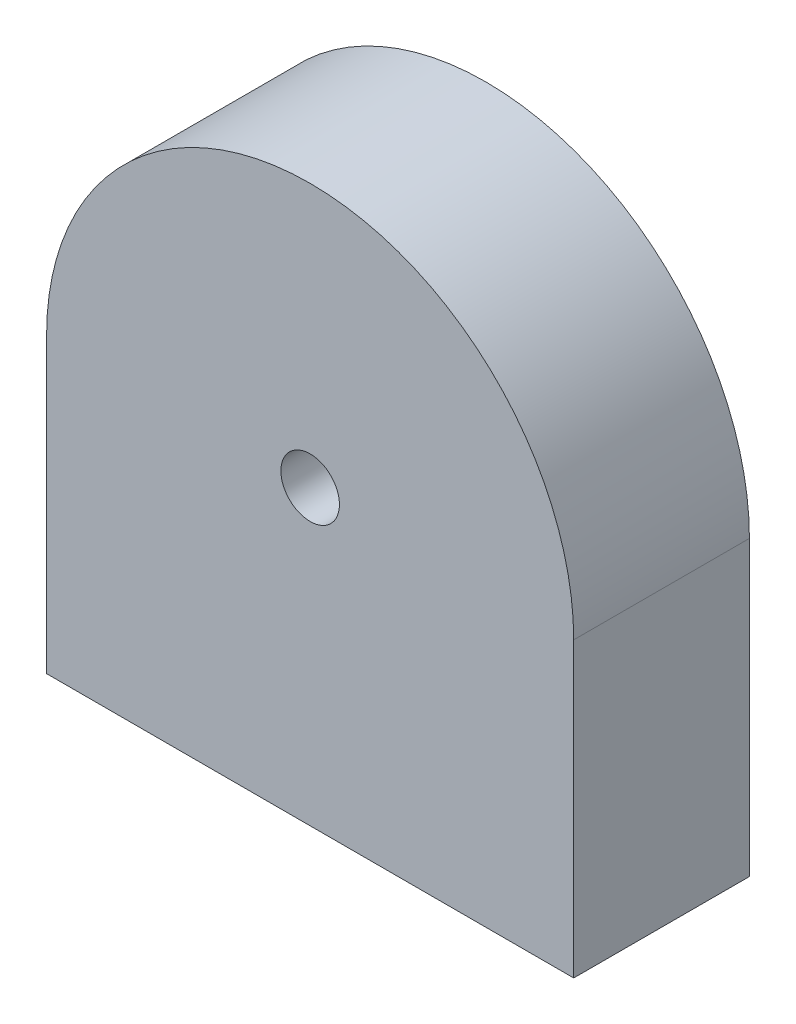
ISO-10303-21;
HEADER;
FILE_DESCRIPTION(('STEP AP214'),'2;1');
FILE_NAME('part.step','',(''),(''),'','','');
FILE_SCHEMA(('AUTOMOTIVE_DESIGN { 1 0 10303 214 1 1 1 1 }'));
ENDSEC;
DATA;
#1=APPLICATION_CONTEXT('core data for automotive mechanical design processes');
#2=APPLICATION_PROTOCOL_DEFINITION('international standard','automotive_design',2000,#1);
#3=PRODUCT_CONTEXT('',#1,'mechanical');
#4=PRODUCT('Part','Part','',(#3));
#5=PRODUCT_RELATED_PRODUCT_CATEGORY('part','',(#4));
#6=PRODUCT_DEFINITION_FORMATION('','',#4);
#7=PRODUCT_DEFINITION_CONTEXT('part definition',#1,'design');
#8=PRODUCT_DEFINITION('design','',#6,#7);
#9=PRODUCT_DEFINITION_SHAPE('','',#8);
#10=(LENGTH_UNIT() NAMED_UNIT(*) SI_UNIT(.MILLI.,.METRE.));
#11=(NAMED_UNIT(*) PLANE_ANGLE_UNIT() SI_UNIT($,.RADIAN.));
#12=(NAMED_UNIT(*) SI_UNIT($,.STERADIAN.) SOLID_ANGLE_UNIT());
#13=UNCERTAINTY_MEASURE_WITH_UNIT(LENGTH_MEASURE(1.E-05),#10,'distance_accuracy_value','');
#14=(GEOMETRIC_REPRESENTATION_CONTEXT(3) GLOBAL_UNCERTAINTY_ASSIGNED_CONTEXT((#13)) GLOBAL_UNIT_ASSIGNED_CONTEXT((#10,
#11,#12)) REPRESENTATION_CONTEXT('',''));
#15=CARTESIAN_POINT('',(0.,0.,0.));
#16=DIRECTION('',(0.,0.,1.));
#17=DIRECTION('',(1.,0.,0.));
#18=AXIS2_PLACEMENT_3D('',#15,#16,#17);
#19=CARTESIAN_POINT('',(4.5,5.,3.));
#20=DIRECTION('',(0.,0.,1.));
#21=DIRECTION('',(1.,0.,0.));
#22=AXIS2_PLACEMENT_3D('',#19,#20,#21);
#23=PLANE('',#22);
#24=DIRECTION('',(0.,-1.,0.));
#25=VECTOR('',#24,1.);
#26=CARTESIAN_POINT('',(0.,0.,3.));
#27=LINE('',#26,#25);
#28=CARTESIAN_POINT('',(0.,5.,3.));
#29=VERTEX_POINT('',#28);
#30=CARTESIAN_POINT('',(0.,0.,3.));
#31=VERTEX_POINT('',#30);
#32=EDGE_CURVE('E85',#29,#31,#27,.T.);
#33=ORIENTED_EDGE('',*,*,#32,.T.);
#34=DIRECTION('',(1.,0.,0.));
#35=VECTOR('',#34,1.);
#36=CARTESIAN_POINT('',(0.,0.,3.));
#37=LINE('',#36,#35);
#38=CARTESIAN_POINT('',(9.,0.,3.));
#39=VERTEX_POINT('',#38);
#40=EDGE_CURVE('E80',#31,#39,#37,.T.);
#41=ORIENTED_EDGE('',*,*,#40,.T.);
#42=DIRECTION('',(0.,1.,0.));
#43=VECTOR('',#42,1.);
#44=CARTESIAN_POINT('',(9.,0.,3.));
#45=LINE('',#44,#43);
#46=CARTESIAN_POINT('',(9.,5.,3.));
#47=VERTEX_POINT('',#46);
#48=EDGE_CURVE('E83',#39,#47,#45,.T.);
#49=ORIENTED_EDGE('',*,*,#48,.T.);
#50=CARTESIAN_POINT('',(4.5,5.,3.));
#51=DIRECTION('',(0.,0.,1.));
#52=DIRECTION('',(1.,0.,0.));
#53=AXIS2_PLACEMENT_3D('',#50,#51,#52);
#54=CIRCLE('',#53,4.5);
#55=EDGE_CURVE('E50',#47,#29,#54,.T.);
#56=ORIENTED_EDGE('',*,*,#55,.T.);
#57=EDGE_LOOP('',(#33,#41,#49,#56));
#58=FACE_BOUND('',#57,.T.);
#59=CARTESIAN_POINT('',(4.5,5.,3.));
#60=DIRECTION('',(0.,0.,1.));
#61=DIRECTION('',(1.,0.,0.));
#62=AXIS2_PLACEMENT_3D('',#59,#60,#61);
#63=CIRCLE('',#62,0.5);
#64=CARTESIAN_POINT('',(5.,5.,3.));
#65=VERTEX_POINT('',#64);
#66=EDGE_CURVE('E100',#65,#65,#63,.T.);
#67=ORIENTED_EDGE('',*,*,#66,.F.);
#68=EDGE_LOOP('',(#67));
#69=FACE_BOUND('',#68,.T.);
#70=ADVANCED_FACE('F33',(#58,#69),#23,.T.);
#71=CARTESIAN_POINT('',(4.5,5.,0.));
#72=DIRECTION('',(0.,0.,1.));
#73=DIRECTION('',(1.,0.,0.));
#74=AXIS2_PLACEMENT_3D('',#71,#72,#73);
#75=PLANE('',#74);
#76=DIRECTION('',(0.,-1.,0.));
#77=VECTOR('',#76,1.);
#78=CARTESIAN_POINT('',(0.,0.,0.));
#79=LINE('',#78,#77);
#80=CARTESIAN_POINT('',(0.,5.,0.));
#81=VERTEX_POINT('',#80);
#82=CARTESIAN_POINT('',(0.,0.,0.));
#83=VERTEX_POINT('',#82);
#84=EDGE_CURVE('E97',#81,#83,#79,.T.);
#85=ORIENTED_EDGE('',*,*,#84,.F.);
#86=CARTESIAN_POINT('',(4.5,5.,0.));
#87=DIRECTION('',(0.,0.,1.));
#88=DIRECTION('',(1.,0.,0.));
#89=AXIS2_PLACEMENT_3D('',#86,#87,#88);
#90=CIRCLE('',#89,4.5);
#91=CARTESIAN_POINT('',(9.,5.,0.));
#92=VERTEX_POINT('',#91);
#93=EDGE_CURVE('E73',#92,#81,#90,.T.);
#94=ORIENTED_EDGE('',*,*,#93,.F.);
#95=DIRECTION('',(0.,1.,0.));
#96=VECTOR('',#95,1.);
#97=CARTESIAN_POINT('',(9.,0.,0.));
#98=LINE('',#97,#96);
#99=CARTESIAN_POINT('',(9.,0.,0.));
#100=VERTEX_POINT('',#99);
#101=EDGE_CURVE('E67',#100,#92,#98,.T.);
#102=ORIENTED_EDGE('',*,*,#101,.F.);
#103=DIRECTION('',(1.,0.,0.));
#104=VECTOR('',#103,1.);
#105=CARTESIAN_POINT('',(0.,0.,0.));
#106=LINE('',#105,#104);
#107=EDGE_CURVE('E89',#83,#100,#106,.T.);
#108=ORIENTED_EDGE('',*,*,#107,.F.);
#109=EDGE_LOOP('',(#85,#94,#102,#108));
#110=FACE_BOUND('',#109,.T.);
#111=CARTESIAN_POINT('',(4.5,5.,0.));
#112=DIRECTION('',(0.,0.,1.));
#113=DIRECTION('',(1.,0.,0.));
#114=AXIS2_PLACEMENT_3D('',#111,#112,#113);
#115=CIRCLE('',#114,0.5);
#116=CARTESIAN_POINT('',(5.,5.,0.));
#117=VERTEX_POINT('',#116);
#118=EDGE_CURVE('E112',#117,#117,#115,.T.);
#119=ORIENTED_EDGE('',*,*,#118,.T.);
#120=EDGE_LOOP('',(#119));
#121=FACE_BOUND('',#120,.T.);
#122=ADVANCED_FACE('F108',(#110,#121),#75,.F.);
#123=CARTESIAN_POINT('',(0.,0.,3.));
#124=DIRECTION('',(1.,0.,0.));
#125=DIRECTION('',(0.,0.,-1.));
#126=AXIS2_PLACEMENT_3D('',#123,#124,#125);
#127=PLANE('',#126);
#128=ORIENTED_EDGE('',*,*,#84,.T.);
#129=DIRECTION('',(0.,0.,-1.));
#130=VECTOR('',#129,1.);
#131=CARTESIAN_POINT('',(0.,0.,3.));
#132=LINE('',#131,#130);
#133=EDGE_CURVE('E11',#31,#83,#132,.T.);
#134=ORIENTED_EDGE('',*,*,#133,.F.);
#135=ORIENTED_EDGE('',*,*,#32,.F.);
#136=DIRECTION('',(0.,0.,-1.));
#137=VECTOR('',#136,1.);
#138=CARTESIAN_POINT('',(0.,5.,3.));
#139=LINE('',#138,#137);
#140=EDGE_CURVE('E93',#29,#81,#139,.T.);
#141=ORIENTED_EDGE('',*,*,#140,.T.);
#142=EDGE_LOOP('',(#128,#134,#135,#141));
#143=FACE_BOUND('',#142,.T.);
#144=ADVANCED_FACE('F35',(#143),#127,.F.);
#145=CARTESIAN_POINT('',(0.,0.,3.));
#146=DIRECTION('',(0.,1.,0.));
#147=DIRECTION('',(0.,0.,1.));
#148=AXIS2_PLACEMENT_3D('',#145,#146,#147);
#149=PLANE('',#148);
#150=ORIENTED_EDGE('',*,*,#107,.T.);
#151=DIRECTION('',(0.,0.,-1.));
#152=VECTOR('',#151,1.);
#153=CARTESIAN_POINT('',(9.,0.,3.));
#154=LINE('',#153,#152);
#155=EDGE_CURVE('E42',#39,#100,#154,.T.);
#156=ORIENTED_EDGE('',*,*,#155,.F.);
#157=ORIENTED_EDGE('',*,*,#40,.F.);
#158=ORIENTED_EDGE('',*,*,#133,.T.);
#159=EDGE_LOOP('',(#150,#156,#157,#158));
#160=FACE_BOUND('',#159,.T.);
#161=ADVANCED_FACE('F88',(#160),#149,.F.);
#162=CARTESIAN_POINT('',(9.,0.,3.));
#163=DIRECTION('',(-1.,0.,0.));
#164=DIRECTION('',(0.,0.,1.));
#165=AXIS2_PLACEMENT_3D('',#162,#163,#164);
#166=PLANE('',#165);
#167=ORIENTED_EDGE('',*,*,#101,.T.);
#168=DIRECTION('',(0.,0.,-1.));
#169=VECTOR('',#168,1.);
#170=CARTESIAN_POINT('',(9.,5.,3.));
#171=LINE('',#170,#169);
#172=EDGE_CURVE('E90',#47,#92,#171,.T.);
#173=ORIENTED_EDGE('',*,*,#172,.F.);
#174=ORIENTED_EDGE('',*,*,#48,.F.);
#175=ORIENTED_EDGE('',*,*,#155,.T.);
#176=EDGE_LOOP('',(#167,#173,#174,#175));
#177=FACE_BOUND('',#176,.T.);
#178=ADVANCED_FACE('F91',(#177),#166,.F.);
#179=CARTESIAN_POINT('',(4.5,5.,3.));
#180=DIRECTION('',(0.,0.,-1.));
#181=DIRECTION('',(-1.,0.,0.));
#182=AXIS2_PLACEMENT_3D('',#179,#180,#181);
#183=CYLINDRICAL_SURFACE('',#182,4.5);
#184=ORIENTED_EDGE('',*,*,#93,.T.);
#185=ORIENTED_EDGE('',*,*,#140,.F.);
#186=ORIENTED_EDGE('',*,*,#55,.F.);
#187=ORIENTED_EDGE('',*,*,#172,.T.);
#188=EDGE_LOOP('',(#184,#185,#186,#187));
#189=FACE_BOUND('',#188,.T.);
#190=ADVANCED_FACE('F105',(#189),#183,.T.);
#191=CARTESIAN_POINT('',(4.5,5.,3.));
#192=DIRECTION('',(0.,0.,-1.));
#193=DIRECTION('',(-1.,0.,0.));
#194=AXIS2_PLACEMENT_3D('',#191,#192,#193);
#195=CYLINDRICAL_SURFACE('',#194,0.5);
#196=ORIENTED_EDGE('',*,*,#66,.T.);
#197=EDGE_LOOP('',(#196));
#198=FACE_BOUND('',#197,.T.);
#199=ORIENTED_EDGE('',*,*,#118,.F.);
#200=EDGE_LOOP('',(#199));
#201=FACE_BOUND('',#200,.T.);
#202=ADVANCED_FACE('F118',(#198,#201),#195,.F.);
#203=CLOSED_SHELL('',(#70,#122,#144,#161,#178,#190,#202));
#204=MANIFOLD_SOLID_BREP('B2',#203);
#205=ADVANCED_BREP_SHAPE_REPRESENTATION('',(#18,#204),#14);
#206=SHAPE_DEFINITION_REPRESENTATION(#9,#205);
ENDSEC;
END-ISO-10303-21;
